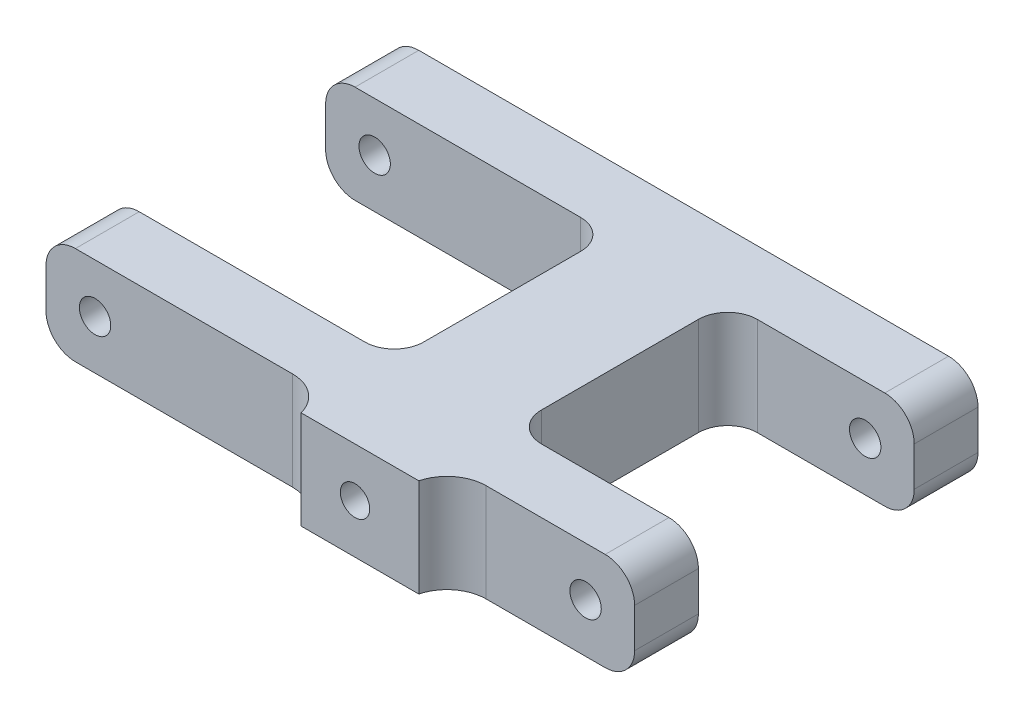
ISO-10303-21;
HEADER;
FILE_DESCRIPTION(('STEP AP214'),'2;1');
FILE_NAME('part.step','',(''),(''),'','','');
FILE_SCHEMA(('AUTOMOTIVE_DESIGN { 1 0 10303 214 1 1 1 1 }'));
ENDSEC;
DATA;
#1=APPLICATION_CONTEXT('core data for automotive mechanical design processes');
#2=APPLICATION_PROTOCOL_DEFINITION('international standard','automotive_design',2000,#1);
#3=PRODUCT_CONTEXT('',#1,'mechanical');
#4=PRODUCT('Part','Part','',(#3));
#5=PRODUCT_RELATED_PRODUCT_CATEGORY('part','',(#4));
#6=PRODUCT_DEFINITION_FORMATION('','',#4);
#7=PRODUCT_DEFINITION_CONTEXT('part definition',#1,'design');
#8=PRODUCT_DEFINITION('design','',#6,#7);
#9=PRODUCT_DEFINITION_SHAPE('','',#8);
#10=(LENGTH_UNIT() NAMED_UNIT(*) SI_UNIT(.MILLI.,.METRE.));
#11=(NAMED_UNIT(*) PLANE_ANGLE_UNIT() SI_UNIT($,.RADIAN.));
#12=(NAMED_UNIT(*) SI_UNIT($,.STERADIAN.) SOLID_ANGLE_UNIT());
#13=UNCERTAINTY_MEASURE_WITH_UNIT(LENGTH_MEASURE(1.E-05),#10,'distance_accuracy_value','');
#14=(GEOMETRIC_REPRESENTATION_CONTEXT(3) GLOBAL_UNCERTAINTY_ASSIGNED_CONTEXT((#13)) GLOBAL_UNIT_ASSIGNED_CONTEXT((#10,
#11,#12)) REPRESENTATION_CONTEXT('',''));
#15=CARTESIAN_POINT('',(0.,0.,0.));
#16=DIRECTION('',(0.,0.,1.));
#17=DIRECTION('',(1.,0.,0.));
#18=AXIS2_PLACEMENT_3D('',#15,#16,#17);
#19=CARTESIAN_POINT('',(0.,10.,35.));
#20=DIRECTION('',(0.,0.,-1.));
#21=DIRECTION('',(-1.,0.,0.));
#22=AXIS2_PLACEMENT_3D('',#19,#20,#21);
#23=PLANE('',#22);
#24=CARTESIAN_POINT('',(5.,5.,35.));
#25=DIRECTION('',(0.,0.,1.));
#26=DIRECTION('',(1.,0.,0.));
#27=AXIS2_PLACEMENT_3D('',#24,#25,#26);
#28=CIRCLE('',#27,1.6);
#29=CARTESIAN_POINT('',(6.6,5.,35.));
#30=VERTEX_POINT('',#29);
#31=EDGE_CURVE('E254',#30,#30,#28,.T.);
#32=ORIENTED_EDGE('',*,*,#31,.F.);
#33=EDGE_LOOP('',(#32));
#34=FACE_BOUND('',#33,.T.);
#35=DIRECTION('',(1.,0.,0.));
#36=VECTOR('',#35,1.);
#37=CARTESIAN_POINT('',(0.,0.,35.));
#38=LINE('',#37,#36);
#39=CARTESIAN_POINT('',(3.,0.,35.));
#40=VERTEX_POINT('',#39);
#41=CARTESIAN_POINT('',(25.1270166537926,0.,35.));
#42=VERTEX_POINT('',#41);
#43=EDGE_CURVE('E312',#40,#42,#38,.T.);
#44=ORIENTED_EDGE('',*,*,#43,.T.);
#45=DIRECTION('',(0.,-1.,0.));
#46=VECTOR('',#45,1.);
#47=CARTESIAN_POINT('',(25.1270166537926,10.,35.));
#48=LINE('',#47,#46);
#49=CARTESIAN_POINT('',(25.1270166537926,10.,35.));
#50=VERTEX_POINT('',#49);
#51=EDGE_CURVE('E54',#42,#50,#48,.F.);
#52=ORIENTED_EDGE('',*,*,#51,.T.);
#53=DIRECTION('',(1.,0.,0.));
#54=VECTOR('',#53,1.);
#55=CARTESIAN_POINT('',(0.,10.,35.));
#56=LINE('',#55,#54);
#57=CARTESIAN_POINT('',(3.,10.,35.));
#58=VERTEX_POINT('',#57);
#59=EDGE_CURVE('E305',#58,#50,#56,.T.);
#60=ORIENTED_EDGE('',*,*,#59,.F.);
#61=CARTESIAN_POINT('',(3.,7.,35.));
#62=DIRECTION('',(0.,0.,-1.));
#63=DIRECTION('',(-1.,0.,0.));
#64=AXIS2_PLACEMENT_3D('',#61,#62,#63);
#65=CIRCLE('',#64,3.);
#66=CARTESIAN_POINT('',(0.,7.,35.));
#67=VERTEX_POINT('',#66);
#68=EDGE_CURVE('E342',#58,#67,#65,.F.);
#69=ORIENTED_EDGE('',*,*,#68,.T.);
#70=DIRECTION('',(0.,-1.,0.));
#71=VECTOR('',#70,1.);
#72=CARTESIAN_POINT('',(0.,10.,35.));
#73=LINE('',#72,#71);
#74=CARTESIAN_POINT('',(0.,3.,35.));
#75=VERTEX_POINT('',#74);
#76=EDGE_CURVE('E325',#67,#75,#73,.T.);
#77=ORIENTED_EDGE('',*,*,#76,.T.);
#78=CARTESIAN_POINT('',(3.,3.,35.));
#79=DIRECTION('',(0.,0.,-1.));
#80=DIRECTION('',(-1.,0.,0.));
#81=AXIS2_PLACEMENT_3D('',#78,#79,#80);
#82=CIRCLE('',#81,3.);
#83=EDGE_CURVE('E344',#75,#40,#82,.F.);
#84=ORIENTED_EDGE('',*,*,#83,.T.);
#85=EDGE_LOOP('',(#44,#52,#60,#69,#77,#84));
#86=FACE_BOUND('',#85,.T.);
#87=ADVANCED_FACE('F33',(#34,#86),#23,.F.);
#88=CARTESIAN_POINT('',(55.,5.,35.));
#89=DIRECTION('',(0.,0.,1.));
#90=DIRECTION('',(1.,0.,0.));
#91=AXIS2_PLACEMENT_3D('',#88,#89,#90);
#92=CIRCLE('',#91,1.59999999999999);
#93=CARTESIAN_POINT('',(56.6,5.,35.));
#94=VERTEX_POINT('',#93);
#95=EDGE_CURVE('E244',#94,#94,#92,.T.);
#96=ORIENTED_EDGE('',*,*,#95,.F.);
#97=EDGE_LOOP('',(#96));
#98=FACE_BOUND('',#97,.T.);
#99=CARTESIAN_POINT('',(44.8729833462074,10.,35.));
#100=VERTEX_POINT('',#99);
#101=CARTESIAN_POINT('',(57.,10.,35.));
#102=VERTEX_POINT('',#101);
#103=EDGE_CURVE('E308',#100,#102,#56,.T.);
#104=ORIENTED_EDGE('',*,*,#103,.F.);
#105=DIRECTION('',(0.,1.,0.));
#106=VECTOR('',#105,1.);
#107=CARTESIAN_POINT('',(44.8729833462074,10.,35.));
#108=LINE('',#107,#106);
#109=CARTESIAN_POINT('',(44.8729833462074,0.,35.));
#110=VERTEX_POINT('',#109);
#111=EDGE_CURVE('E448',#100,#110,#108,.F.);
#112=ORIENTED_EDGE('',*,*,#111,.T.);
#113=CARTESIAN_POINT('',(57.,0.,35.));
#114=VERTEX_POINT('',#113);
#115=EDGE_CURVE('E299',#110,#114,#38,.T.);
#116=ORIENTED_EDGE('',*,*,#115,.T.);
#117=CARTESIAN_POINT('',(57.,3.,35.));
#118=DIRECTION('',(0.,0.,-1.));
#119=DIRECTION('',(-1.,0.,0.));
#120=AXIS2_PLACEMENT_3D('',#117,#118,#119);
#121=CIRCLE('',#120,3.);
#122=CARTESIAN_POINT('',(60.,3.,35.));
#123=VERTEX_POINT('',#122);
#124=EDGE_CURVE('E340',#114,#123,#121,.F.);
#125=ORIENTED_EDGE('',*,*,#124,.T.);
#126=DIRECTION('',(0.,-1.,0.));
#127=VECTOR('',#126,1.);
#128=CARTESIAN_POINT('',(60.,10.,35.));
#129=LINE('',#128,#127);
#130=CARTESIAN_POINT('',(60.,7.,35.));
#131=VERTEX_POINT('',#130);
#132=EDGE_CURVE('E322',#131,#123,#129,.T.);
#133=ORIENTED_EDGE('',*,*,#132,.F.);
#134=CARTESIAN_POINT('',(57.,7.,35.));
#135=DIRECTION('',(0.,0.,-1.));
#136=DIRECTION('',(-1.,0.,0.));
#137=AXIS2_PLACEMENT_3D('',#134,#135,#136);
#138=CIRCLE('',#137,3.);
#139=EDGE_CURVE('E337',#131,#102,#138,.F.);
#140=ORIENTED_EDGE('',*,*,#139,.T.);
#141=EDGE_LOOP('',(#104,#112,#116,#125,#133,#140));
#142=FACE_BOUND('',#141,.T.);
#143=ADVANCED_FACE('F460',(#98,#142),#23,.F.);
#144=CARTESIAN_POINT('',(0.,10.,0.));
#145=DIRECTION('',(1.,0.,0.));
#146=DIRECTION('',(0.,0.,-1.));
#147=AXIS2_PLACEMENT_3D('',#144,#145,#146);
#148=PLANE('',#147);
#149=DIRECTION('',(0.,-1.,0.));
#150=VECTOR('',#149,1.);
#151=CARTESIAN_POINT('',(0.,10.,0.));
#152=LINE('',#151,#150);
#153=CARTESIAN_POINT('',(0.,7.,0.));
#154=VERTEX_POINT('',#153);
#155=CARTESIAN_POINT('',(0.,3.,0.));
#156=VERTEX_POINT('',#155);
#157=EDGE_CURVE('E311',#154,#156,#152,.T.);
#158=ORIENTED_EDGE('',*,*,#157,.T.);
#159=DIRECTION('',(0.,0.,1.));
#160=VECTOR('',#159,1.);
#161=CARTESIAN_POINT('',(0.,3.,0.));
#162=LINE('',#161,#160);
#163=CARTESIAN_POINT('',(0.,3.,6.5));
#164=VERTEX_POINT('',#163);
#165=EDGE_CURVE('E376',#156,#164,#162,.T.);
#166=ORIENTED_EDGE('',*,*,#165,.T.);
#167=DIRECTION('',(0.,-1.,0.));
#168=VECTOR('',#167,1.);
#169=CARTESIAN_POINT('',(0.,10.,6.5));
#170=LINE('',#169,#168);
#171=CARTESIAN_POINT('',(0.,7.,6.5));
#172=VERTEX_POINT('',#171);
#173=EDGE_CURVE('E264',#172,#164,#170,.T.);
#174=ORIENTED_EDGE('',*,*,#173,.F.);
#175=DIRECTION('',(0.,0.,1.));
#176=VECTOR('',#175,1.);
#177=CARTESIAN_POINT('',(0.,7.,0.));
#178=LINE('',#177,#176);
#179=EDGE_CURVE('E374',#172,#154,#178,.F.);
#180=ORIENTED_EDGE('',*,*,#179,.T.);
#181=EDGE_LOOP('',(#158,#166,#174,#180));
#182=FACE_BOUND('',#181,.T.);
#183=ADVANCED_FACE('F481',(#182),#148,.F.);
#184=CARTESIAN_POINT('',(60.,10.,0.));
#185=DIRECTION('',(-1.,0.,0.));
#186=DIRECTION('',(0.,0.,1.));
#187=AXIS2_PLACEMENT_3D('',#184,#185,#186);
#188=PLANE('',#187);
#189=ORIENTED_EDGE('',*,*,#132,.T.);
#190=DIRECTION('',(0.,0.,-1.));
#191=VECTOR('',#190,1.);
#192=CARTESIAN_POINT('',(60.,3.,0.));
#193=LINE('',#192,#191);
#194=CARTESIAN_POINT('',(60.,3.,28.5));
#195=VERTEX_POINT('',#194);
#196=EDGE_CURVE('E404',#123,#195,#193,.T.);
#197=ORIENTED_EDGE('',*,*,#196,.T.);
#198=DIRECTION('',(0.,-1.,0.));
#199=VECTOR('',#198,1.);
#200=CARTESIAN_POINT('',(60.,10.,28.5));
#201=LINE('',#200,#199);
#202=CARTESIAN_POINT('',(60.,7.,28.5));
#203=VERTEX_POINT('',#202);
#204=EDGE_CURVE('E279',#203,#195,#201,.T.);
#205=ORIENTED_EDGE('',*,*,#204,.F.);
#206=DIRECTION('',(0.,0.,-1.));
#207=VECTOR('',#206,1.);
#208=CARTESIAN_POINT('',(60.,7.,35.));
#209=LINE('',#208,#207);
#210=EDGE_CURVE('E402',#203,#131,#209,.F.);
#211=ORIENTED_EDGE('',*,*,#210,.T.);
#212=EDGE_LOOP('',(#189,#197,#205,#211));
#213=FACE_BOUND('',#212,.T.);
#214=ADVANCED_FACE('F491',(#213),#188,.F.);
#215=DIRECTION('',(0.,1.,0.));
#216=VECTOR('',#215,1.);
#217=CARTESIAN_POINT('',(0.,10.,28.5));
#218=LINE('',#217,#216);
#219=CARTESIAN_POINT('',(0.,3.,28.5));
#220=VERTEX_POINT('',#219);
#221=CARTESIAN_POINT('',(0.,7.,28.5));
#222=VERTEX_POINT('',#221);
#223=EDGE_CURVE('E269',#220,#222,#218,.T.);
#224=ORIENTED_EDGE('',*,*,#223,.F.);
#225=DIRECTION('',(0.,0.,1.));
#226=VECTOR('',#225,1.);
#227=CARTESIAN_POINT('',(0.,3.,0.));
#228=LINE('',#227,#226);
#229=EDGE_CURVE('E334',#220,#75,#228,.T.);
#230=ORIENTED_EDGE('',*,*,#229,.T.);
#231=ORIENTED_EDGE('',*,*,#76,.F.);
#232=DIRECTION('',(0.,0.,1.));
#233=VECTOR('',#232,1.);
#234=CARTESIAN_POINT('',(0.,7.,28.5));
#235=LINE('',#234,#233);
#236=EDGE_CURVE('E328',#67,#222,#235,.F.);
#237=ORIENTED_EDGE('',*,*,#236,.T.);
#238=EDGE_LOOP('',(#224,#230,#231,#237));
#239=FACE_BOUND('',#238,.T.);
#240=ADVANCED_FACE('F488',(#239),#148,.F.);
#241=DIRECTION('',(0.,-1.,0.));
#242=VECTOR('',#241,1.);
#243=CARTESIAN_POINT('',(60.,10.,0.));
#244=LINE('',#243,#242);
#245=CARTESIAN_POINT('',(60.,7.,0.));
#246=VERTEX_POINT('',#245);
#247=CARTESIAN_POINT('',(60.,3.,0.));
#248=VERTEX_POINT('',#247);
#249=EDGE_CURVE('E319',#246,#248,#244,.T.);
#250=ORIENTED_EDGE('',*,*,#249,.F.);
#251=DIRECTION('',(0.,0.,-1.));
#252=VECTOR('',#251,1.);
#253=CARTESIAN_POINT('',(60.,7.,6.5));
#254=LINE('',#253,#252);
#255=CARTESIAN_POINT('',(60.,7.,6.5));
#256=VERTEX_POINT('',#255);
#257=EDGE_CURVE('E395',#246,#256,#254,.F.);
#258=ORIENTED_EDGE('',*,*,#257,.T.);
#259=DIRECTION('',(0.,1.,0.));
#260=VECTOR('',#259,1.);
#261=CARTESIAN_POINT('',(60.,10.,6.5));
#262=LINE('',#261,#260);
#263=CARTESIAN_POINT('',(60.,3.,6.5));
#264=VERTEX_POINT('',#263);
#265=EDGE_CURVE('E289',#264,#256,#262,.T.);
#266=ORIENTED_EDGE('',*,*,#265,.F.);
#267=DIRECTION('',(0.,0.,-1.));
#268=VECTOR('',#267,1.);
#269=CARTESIAN_POINT('',(60.,3.,0.));
#270=LINE('',#269,#268);
#271=EDGE_CURVE('E392',#264,#248,#270,.T.);
#272=ORIENTED_EDGE('',*,*,#271,.T.);
#273=EDGE_LOOP('',(#250,#258,#266,#272));
#274=FACE_BOUND('',#273,.T.);
#275=ADVANCED_FACE('F486',(#274),#188,.F.);
#276=CARTESIAN_POINT('',(0.,10.,0.));
#277=DIRECTION('',(0.,0.,1.));
#278=DIRECTION('',(1.,0.,0.));
#279=AXIS2_PLACEMENT_3D('',#276,#277,#278);
#280=PLANE('',#279);
#281=CARTESIAN_POINT('',(55.,5.,0.));
#282=DIRECTION('',(0.,0.,1.));
#283=DIRECTION('',(1.,0.,0.));
#284=AXIS2_PLACEMENT_3D('',#281,#282,#283);
#285=CIRCLE('',#284,1.59999999999999);
#286=CARTESIAN_POINT('',(56.6,5.,0.));
#287=VERTEX_POINT('',#286);
#288=EDGE_CURVE('E245',#287,#287,#285,.T.);
#289=ORIENTED_EDGE('',*,*,#288,.T.);
#290=EDGE_LOOP('',(#289));
#291=FACE_BOUND('',#290,.T.);
#292=CARTESIAN_POINT('',(5.,5.,0.));
#293=DIRECTION('',(0.,0.,1.));
#294=DIRECTION('',(1.,0.,0.));
#295=AXIS2_PLACEMENT_3D('',#292,#293,#294);
#296=CIRCLE('',#295,1.6);
#297=CARTESIAN_POINT('',(6.6,5.,0.));
#298=VERTEX_POINT('',#297);
#299=EDGE_CURVE('E255',#298,#298,#296,.T.);
#300=ORIENTED_EDGE('',*,*,#299,.T.);
#301=EDGE_LOOP('',(#300));
#302=FACE_BOUND('',#301,.T.);
#303=DIRECTION('',(-1.,0.,0.));
#304=VECTOR('',#303,1.);
#305=CARTESIAN_POINT('',(0.,0.,0.));
#306=LINE('',#305,#304);
#307=CARTESIAN_POINT('',(57.,0.,0.));
#308=VERTEX_POINT('',#307);
#309=CARTESIAN_POINT('',(3.,0.,0.));
#310=VERTEX_POINT('',#309);
#311=EDGE_CURVE('E314',#308,#310,#306,.T.);
#312=ORIENTED_EDGE('',*,*,#311,.T.);
#313=CARTESIAN_POINT('',(3.,3.,0.));
#314=DIRECTION('',(0.,0.,1.));
#315=DIRECTION('',(1.,0.,0.));
#316=AXIS2_PLACEMENT_3D('',#313,#314,#315);
#317=CIRCLE('',#316,3.);
#318=EDGE_CURVE('E390',#310,#156,#317,.F.);
#319=ORIENTED_EDGE('',*,*,#318,.T.);
#320=ORIENTED_EDGE('',*,*,#157,.F.);
#321=CARTESIAN_POINT('',(3.,7.,0.));
#322=DIRECTION('',(0.,0.,1.));
#323=DIRECTION('',(1.,0.,0.));
#324=AXIS2_PLACEMENT_3D('',#321,#322,#323);
#325=CIRCLE('',#324,3.);
#326=CARTESIAN_POINT('',(3.,10.,0.));
#327=VERTEX_POINT('',#326);
#328=EDGE_CURVE('E388',#154,#327,#325,.F.);
#329=ORIENTED_EDGE('',*,*,#328,.T.);
#330=DIRECTION('',(-1.,0.,0.));
#331=VECTOR('',#330,1.);
#332=CARTESIAN_POINT('',(0.,10.,0.));
#333=LINE('',#332,#331);
#334=CARTESIAN_POINT('',(57.,10.,0.));
#335=VERTEX_POINT('',#334);
#336=EDGE_CURVE('E307',#335,#327,#333,.T.);
#337=ORIENTED_EDGE('',*,*,#336,.F.);
#338=CARTESIAN_POINT('',(57.,7.,0.));
#339=DIRECTION('',(0.,0.,1.));
#340=DIRECTION('',(1.,0.,0.));
#341=AXIS2_PLACEMENT_3D('',#338,#339,#340);
#342=CIRCLE('',#341,3.);
#343=EDGE_CURVE('E386',#335,#246,#342,.F.);
#344=ORIENTED_EDGE('',*,*,#343,.T.);
#345=ORIENTED_EDGE('',*,*,#249,.T.);
#346=CARTESIAN_POINT('',(57.,3.,0.));
#347=DIRECTION('',(0.,0.,1.));
#348=DIRECTION('',(1.,0.,0.));
#349=AXIS2_PLACEMENT_3D('',#346,#347,#348);
#350=CIRCLE('',#349,3.);
#351=EDGE_CURVE('E384',#248,#308,#350,.F.);
#352=ORIENTED_EDGE('',*,*,#351,.T.);
#353=EDGE_LOOP('',(#312,#319,#320,#329,#337,#344,#345,#352));
#354=FACE_BOUND('',#353,.T.);
#355=ADVANCED_FACE('F577',(#291,#302,#354),#280,.F.);
#356=CARTESIAN_POINT('',(0.,10.,0.));
#357=DIRECTION('',(0.,1.,0.));
#358=DIRECTION('',(0.,0.,1.));
#359=AXIS2_PLACEMENT_3D('',#356,#357,#358);
#360=PLANE('',#359);
#361=DIRECTION('',(0.,0.,-1.));
#362=VECTOR('',#361,1.);
#363=CARTESIAN_POINT('',(29.,10.,6.5));
#364=LINE('',#363,#362);
#365=CARTESIAN_POINT('',(29.,10.,25.5));
#366=VERTEX_POINT('',#365);
#367=CARTESIAN_POINT('',(29.,10.,9.5));
#368=VERTEX_POINT('',#367);
#369=EDGE_CURVE('E268',#366,#368,#364,.T.);
#370=ORIENTED_EDGE('',*,*,#369,.F.);
#371=CARTESIAN_POINT('',(26.,10.,25.5));
#372=DIRECTION('',(0.,1.,0.));
#373=DIRECTION('',(0.,0.,1.));
#374=AXIS2_PLACEMENT_3D('',#371,#372,#373);
#375=CIRCLE('',#374,3.);
#376=CARTESIAN_POINT('',(26.,10.,28.5));
#377=VERTEX_POINT('',#376);
#378=EDGE_CURVE('E440',#366,#377,#375,.F.);
#379=ORIENTED_EDGE('',*,*,#378,.T.);
#380=DIRECTION('',(-1.,0.,0.));
#381=VECTOR('',#380,1.);
#382=CARTESIAN_POINT('',(29.,10.,28.5));
#383=LINE('',#382,#381);
#384=CARTESIAN_POINT('',(3.00000000000001,10.,28.5));
#385=VERTEX_POINT('',#384);
#386=EDGE_CURVE('E280',#377,#385,#383,.T.);
#387=ORIENTED_EDGE('',*,*,#386,.T.);
#388=DIRECTION('',(0.,0.,1.));
#389=VECTOR('',#388,1.);
#390=CARTESIAN_POINT('',(3.,10.,35.));
#391=LINE('',#390,#389);
#392=EDGE_CURVE('E371',#385,#58,#391,.T.);
#393=ORIENTED_EDGE('',*,*,#392,.T.);
#394=ORIENTED_EDGE('',*,*,#59,.T.);
#395=CARTESIAN_POINT('',(25.1270166537926,10.,39.));
#396=DIRECTION('',(0.,1.,0.));
#397=DIRECTION('',(0.,0.,1.));
#398=AXIS2_PLACEMENT_3D('',#395,#396,#397);
#399=CIRCLE('',#398,4.);
#400=CARTESIAN_POINT('',(29.,10.,38.));
#401=VERTEX_POINT('',#400);
#402=EDGE_CURVE('E11',#50,#401,#399,.F.);
#403=ORIENTED_EDGE('',*,*,#402,.T.);
#404=DIRECTION('',(-1.,0.,0.));
#405=VECTOR('',#404,1.);
#406=CARTESIAN_POINT('',(29.,10.,38.));
#407=LINE('',#406,#405);
#408=CARTESIAN_POINT('',(41.,10.,38.));
#409=VERTEX_POINT('',#408);
#410=EDGE_CURVE('E234',#409,#401,#407,.T.);
#411=ORIENTED_EDGE('',*,*,#410,.F.);
#412=CARTESIAN_POINT('',(44.8729833462074,10.,39.));
#413=DIRECTION('',(0.,1.,0.));
#414=DIRECTION('',(0.,0.,1.));
#415=AXIS2_PLACEMENT_3D('',#412,#413,#414);
#416=CIRCLE('',#415,4.);
#417=EDGE_CURVE('E451',#409,#100,#416,.F.);
#418=ORIENTED_EDGE('',*,*,#417,.T.);
#419=ORIENTED_EDGE('',*,*,#103,.T.);
#420=DIRECTION('',(0.,0.,-1.));
#421=VECTOR('',#420,1.);
#422=CARTESIAN_POINT('',(57.,10.,28.5));
#423=LINE('',#422,#421);
#424=CARTESIAN_POINT('',(57.,10.,28.5));
#425=VERTEX_POINT('',#424);
#426=EDGE_CURVE('E362',#102,#425,#423,.T.);
#427=ORIENTED_EDGE('',*,*,#426,.T.);
#428=DIRECTION('',(1.,0.,0.));
#429=VECTOR('',#428,1.);
#430=CARTESIAN_POINT('',(41.,10.,28.5));
#431=LINE('',#430,#429);
#432=CARTESIAN_POINT('',(44.,10.,28.5));
#433=VERTEX_POINT('',#432);
#434=EDGE_CURVE('E297',#433,#425,#431,.T.);
#435=ORIENTED_EDGE('',*,*,#434,.F.);
#436=CARTESIAN_POINT('',(44.,10.,25.5));
#437=DIRECTION('',(0.,1.,0.));
#438=DIRECTION('',(0.,0.,1.));
#439=AXIS2_PLACEMENT_3D('',#436,#437,#438);
#440=CIRCLE('',#439,3.);
#441=CARTESIAN_POINT('',(41.,10.,25.5));
#442=VERTEX_POINT('',#441);
#443=EDGE_CURVE('E434',#433,#442,#440,.F.);
#444=ORIENTED_EDGE('',*,*,#443,.T.);
#445=DIRECTION('',(0.,0.,1.));
#446=VECTOR('',#445,1.);
#447=CARTESIAN_POINT('',(41.,10.,28.5));
#448=LINE('',#447,#446);
#449=CARTESIAN_POINT('',(41.,10.,9.5));
#450=VERTEX_POINT('',#449);
#451=EDGE_CURVE('E288',#450,#442,#448,.T.);
#452=ORIENTED_EDGE('',*,*,#451,.F.);
#453=CARTESIAN_POINT('',(44.,10.,9.5));
#454=DIRECTION('',(0.,1.,0.));
#455=DIRECTION('',(0.,0.,1.));
#456=AXIS2_PLACEMENT_3D('',#453,#454,#455);
#457=CIRCLE('',#456,3.);
#458=CARTESIAN_POINT('',(44.,10.,6.5));
#459=VERTEX_POINT('',#458);
#460=EDGE_CURVE('E436',#450,#459,#457,.F.);
#461=ORIENTED_EDGE('',*,*,#460,.T.);
#462=DIRECTION('',(1.,0.,0.));
#463=VECTOR('',#462,1.);
#464=CARTESIAN_POINT('',(41.,10.,6.5));
#465=LINE('',#464,#463);
#466=CARTESIAN_POINT('',(57.,10.,6.5));
#467=VERTEX_POINT('',#466);
#468=EDGE_CURVE('E300',#459,#467,#465,.T.);
#469=ORIENTED_EDGE('',*,*,#468,.T.);
#470=DIRECTION('',(0.,0.,-1.));
#471=VECTOR('',#470,1.);
#472=CARTESIAN_POINT('',(57.,10.,0.));
#473=LINE('',#472,#471);
#474=EDGE_CURVE('E365',#467,#335,#473,.T.);
#475=ORIENTED_EDGE('',*,*,#474,.T.);
#476=ORIENTED_EDGE('',*,*,#336,.T.);
#477=DIRECTION('',(0.,0.,1.));
#478=VECTOR('',#477,1.);
#479=CARTESIAN_POINT('',(3.,10.,6.5));
#480=LINE('',#479,#478);
#481=CARTESIAN_POINT('',(3.00000000000001,10.,6.5));
#482=VERTEX_POINT('',#481);
#483=EDGE_CURVE('E368',#327,#482,#480,.T.);
#484=ORIENTED_EDGE('',*,*,#483,.T.);
#485=DIRECTION('',(-1.,0.,0.));
#486=VECTOR('',#485,1.);
#487=CARTESIAN_POINT('',(29.,10.,6.5));
#488=LINE('',#487,#486);
#489=CARTESIAN_POINT('',(26.,10.,6.5));
#490=VERTEX_POINT('',#489);
#491=EDGE_CURVE('E277',#490,#482,#488,.T.);
#492=ORIENTED_EDGE('',*,*,#491,.F.);
#493=CARTESIAN_POINT('',(26.,10.,9.5));
#494=DIRECTION('',(0.,1.,0.));
#495=DIRECTION('',(0.,0.,1.));
#496=AXIS2_PLACEMENT_3D('',#493,#494,#495);
#497=CIRCLE('',#496,3.);
#498=EDGE_CURVE('E446',#490,#368,#497,.F.);
#499=ORIENTED_EDGE('',*,*,#498,.T.);
#500=EDGE_LOOP('',(#370,#379,#387,#393,#394,#403,#411,#418,#419,#427,#435,#444,#452,#461,#469,
#475,#476,#484,#492,#499));
#501=FACE_BOUND('',#500,.T.);
#502=ADVANCED_FACE('F456',(#501),#360,.T.);
#503=CARTESIAN_POINT('',(0.,0.,0.));
#504=DIRECTION('',(0.,1.,0.));
#505=DIRECTION('',(0.,0.,1.));
#506=AXIS2_PLACEMENT_3D('',#503,#504,#505);
#507=PLANE('',#506);
#508=ORIENTED_EDGE('',*,*,#43,.F.);
#509=DIRECTION('',(0.,0.,1.));
#510=VECTOR('',#509,1.);
#511=CARTESIAN_POINT('',(3.,0.,0.));
#512=LINE('',#511,#510);
#513=CARTESIAN_POINT('',(3.00000000000001,0.,28.5));
#514=VERTEX_POINT('',#513);
#515=EDGE_CURVE('E354',#40,#514,#512,.F.);
#516=ORIENTED_EDGE('',*,*,#515,.T.);
#517=DIRECTION('',(-1.,0.,0.));
#518=VECTOR('',#517,1.);
#519=CARTESIAN_POINT('',(29.,0.,28.5));
#520=LINE('',#519,#518);
#521=CARTESIAN_POINT('',(26.,0.,28.5));
#522=VERTEX_POINT('',#521);
#523=EDGE_CURVE('E282',#522,#514,#520,.T.);
#524=ORIENTED_EDGE('',*,*,#523,.F.);
#525=CARTESIAN_POINT('',(26.,0.,25.5));
#526=DIRECTION('',(0.,1.,0.));
#527=DIRECTION('',(0.,0.,1.));
#528=AXIS2_PLACEMENT_3D('',#525,#526,#527);
#529=CIRCLE('',#528,3.);
#530=CARTESIAN_POINT('',(29.,0.,25.5));
#531=VERTEX_POINT('',#530);
#532=EDGE_CURVE('E442',#522,#531,#529,.T.);
#533=ORIENTED_EDGE('',*,*,#532,.T.);
#534=DIRECTION('',(0.,0.,1.));
#535=VECTOR('',#534,1.);
#536=CARTESIAN_POINT('',(29.,0.,6.5));
#537=LINE('',#536,#535);
#538=CARTESIAN_POINT('',(29.,0.,9.5));
#539=VERTEX_POINT('',#538);
#540=EDGE_CURVE('E265',#539,#531,#537,.T.);
#541=ORIENTED_EDGE('',*,*,#540,.F.);
#542=CARTESIAN_POINT('',(26.,0.,9.5));
#543=DIRECTION('',(0.,1.,0.));
#544=DIRECTION('',(0.,0.,1.));
#545=AXIS2_PLACEMENT_3D('',#542,#543,#544);
#546=CIRCLE('',#545,3.);
#547=CARTESIAN_POINT('',(26.,0.,6.5));
#548=VERTEX_POINT('',#547);
#549=EDGE_CURVE('E444',#539,#548,#546,.T.);
#550=ORIENTED_EDGE('',*,*,#549,.T.);
#551=DIRECTION('',(-1.,0.,0.));
#552=VECTOR('',#551,1.);
#553=CARTESIAN_POINT('',(29.,0.,6.5));
#554=LINE('',#553,#552);
#555=CARTESIAN_POINT('',(3.00000000000001,0.,6.5));
#556=VERTEX_POINT('',#555);
#557=EDGE_CURVE('E272',#548,#556,#554,.T.);
#558=ORIENTED_EDGE('',*,*,#557,.T.);
#559=DIRECTION('',(0.,0.,1.));
#560=VECTOR('',#559,1.);
#561=CARTESIAN_POINT('',(3.,0.,0.));
#562=LINE('',#561,#560);
#563=EDGE_CURVE('E352',#556,#310,#562,.F.);
#564=ORIENTED_EDGE('',*,*,#563,.T.);
#565=ORIENTED_EDGE('',*,*,#311,.F.);
#566=DIRECTION('',(0.,0.,-1.));
#567=VECTOR('',#566,1.);
#568=CARTESIAN_POINT('',(57.,0.,0.));
#569=LINE('',#568,#567);
#570=CARTESIAN_POINT('',(57.,0.,6.5));
#571=VERTEX_POINT('',#570);
#572=EDGE_CURVE('E349',#308,#571,#569,.F.);
#573=ORIENTED_EDGE('',*,*,#572,.T.);
#574=DIRECTION('',(1.,0.,0.));
#575=VECTOR('',#574,1.);
#576=CARTESIAN_POINT('',(41.,0.,6.5));
#577=LINE('',#576,#575);
#578=CARTESIAN_POINT('',(44.,0.,6.5));
#579=VERTEX_POINT('',#578);
#580=EDGE_CURVE('E302',#579,#571,#577,.T.);
#581=ORIENTED_EDGE('',*,*,#580,.F.);
#582=CARTESIAN_POINT('',(44.,0.,9.5));
#583=DIRECTION('',(0.,1.,0.));
#584=DIRECTION('',(0.,0.,1.));
#585=AXIS2_PLACEMENT_3D('',#582,#583,#584);
#586=CIRCLE('',#585,3.);
#587=CARTESIAN_POINT('',(41.,0.,9.5));
#588=VERTEX_POINT('',#587);
#589=EDGE_CURVE('E438',#579,#588,#586,.T.);
#590=ORIENTED_EDGE('',*,*,#589,.T.);
#591=DIRECTION('',(0.,0.,-1.));
#592=VECTOR('',#591,1.);
#593=CARTESIAN_POINT('',(41.,0.,28.5));
#594=LINE('',#593,#592);
#595=CARTESIAN_POINT('',(41.,0.,25.5));
#596=VERTEX_POINT('',#595);
#597=EDGE_CURVE('E285',#596,#588,#594,.T.);
#598=ORIENTED_EDGE('',*,*,#597,.F.);
#599=CARTESIAN_POINT('',(44.,0.,25.5));
#600=DIRECTION('',(0.,1.,0.));
#601=DIRECTION('',(0.,0.,1.));
#602=AXIS2_PLACEMENT_3D('',#599,#600,#601);
#603=CIRCLE('',#602,3.);
#604=CARTESIAN_POINT('',(44.,0.,28.5));
#605=VERTEX_POINT('',#604);
#606=EDGE_CURVE('E432',#596,#605,#603,.T.);
#607=ORIENTED_EDGE('',*,*,#606,.T.);
#608=DIRECTION('',(1.,0.,0.));
#609=VECTOR('',#608,1.);
#610=CARTESIAN_POINT('',(41.,0.,28.5));
#611=LINE('',#610,#609);
#612=CARTESIAN_POINT('',(57.,0.,28.5));
#613=VERTEX_POINT('',#612);
#614=EDGE_CURVE('E292',#605,#613,#611,.T.);
#615=ORIENTED_EDGE('',*,*,#614,.T.);
#616=DIRECTION('',(0.,0.,-1.));
#617=VECTOR('',#616,1.);
#618=CARTESIAN_POINT('',(57.,0.,0.));
#619=LINE('',#618,#617);
#620=EDGE_CURVE('E346',#613,#114,#619,.F.);
#621=ORIENTED_EDGE('',*,*,#620,.T.);
#622=ORIENTED_EDGE('',*,*,#115,.F.);
#623=CARTESIAN_POINT('',(44.8729833462074,0.,39.));
#624=DIRECTION('',(0.,1.,0.));
#625=DIRECTION('',(0.,0.,1.));
#626=AXIS2_PLACEMENT_3D('',#623,#624,#625);
#627=CIRCLE('',#626,4.);
#628=CARTESIAN_POINT('',(41.,0.,38.));
#629=VERTEX_POINT('',#628);
#630=EDGE_CURVE('E220',#110,#629,#627,.T.);
#631=ORIENTED_EDGE('',*,*,#630,.T.);
#632=DIRECTION('',(1.,0.,0.));
#633=VECTOR('',#632,1.);
#634=CARTESIAN_POINT('',(29.,0.,38.));
#635=LINE('',#634,#633);
#636=CARTESIAN_POINT('',(29.,0.,38.));
#637=VERTEX_POINT('',#636);
#638=EDGE_CURVE('E222',#637,#629,#635,.T.);
#639=ORIENTED_EDGE('',*,*,#638,.F.);
#640=CARTESIAN_POINT('',(25.1270166537926,0.,39.));
#641=DIRECTION('',(0.,1.,0.));
#642=DIRECTION('',(0.,0.,1.));
#643=AXIS2_PLACEMENT_3D('',#640,#641,#642);
#644=CIRCLE('',#643,4.);
#645=EDGE_CURVE('E41',#637,#42,#644,.T.);
#646=ORIENTED_EDGE('',*,*,#645,.T.);
#647=EDGE_LOOP('',(#508,#516,#524,#533,#541,#550,#558,#564,#565,#573,#581,#590,#598,#607,#615,
#621,#622,#631,#639,#646));
#648=FACE_BOUND('',#647,.T.);
#649=ADVANCED_FACE('F223',(#648),#507,.F.);
#650=CARTESIAN_POINT('',(41.,10.,28.5));
#651=DIRECTION('',(0.,0.,1.));
#652=DIRECTION('',(1.,0.,0.));
#653=AXIS2_PLACEMENT_3D('',#650,#651,#652);
#654=PLANE('',#653);
#655=CARTESIAN_POINT('',(55.,5.,28.5));
#656=DIRECTION('',(0.,0.,1.));
#657=DIRECTION('',(1.,0.,0.));
#658=AXIS2_PLACEMENT_3D('',#655,#656,#657);
#659=CIRCLE('',#658,1.59999999999999);
#660=CARTESIAN_POINT('',(56.6,5.,28.5));
#661=VERTEX_POINT('',#660);
#662=EDGE_CURVE('E251',#661,#661,#659,.T.);
#663=ORIENTED_EDGE('',*,*,#662,.T.);
#664=EDGE_LOOP('',(#663));
#665=FACE_BOUND('',#664,.T.);
#666=ORIENTED_EDGE('',*,*,#614,.F.);
#667=DIRECTION('',(0.,-1.,0.));
#668=VECTOR('',#667,1.);
#669=CARTESIAN_POINT('',(44.,10.,28.5));
#670=LINE('',#669,#668);
#671=EDGE_CURVE('E418',#605,#433,#670,.F.);
#672=ORIENTED_EDGE('',*,*,#671,.T.);
#673=ORIENTED_EDGE('',*,*,#434,.T.);
#674=CARTESIAN_POINT('',(57.,7.,28.5));
#675=DIRECTION('',(0.,0.,1.));
#676=DIRECTION('',(1.,0.,0.));
#677=AXIS2_PLACEMENT_3D('',#674,#675,#676);
#678=CIRCLE('',#677,3.);
#679=EDGE_CURVE('E407',#425,#203,#678,.F.);
#680=ORIENTED_EDGE('',*,*,#679,.T.);
#681=ORIENTED_EDGE('',*,*,#204,.T.);
#682=CARTESIAN_POINT('',(57.,3.,28.5));
#683=DIRECTION('',(0.,0.,1.));
#684=DIRECTION('',(1.,0.,0.));
#685=AXIS2_PLACEMENT_3D('',#682,#683,#684);
#686=CIRCLE('',#685,3.);
#687=EDGE_CURVE('E409',#195,#613,#686,.F.);
#688=ORIENTED_EDGE('',*,*,#687,.T.);
#689=EDGE_LOOP('',(#666,#672,#673,#680,#681,#688));
#690=FACE_BOUND('',#689,.T.);
#691=ADVANCED_FACE('F615',(#665,#690),#654,.F.);
#692=CARTESIAN_POINT('',(41.,10.,6.5));
#693=DIRECTION('',(0.,0.,-1.));
#694=DIRECTION('',(0.,1.,0.));
#695=AXIS2_PLACEMENT_3D('',#692,#693,#694);
#696=PLANE('',#695);
#697=CARTESIAN_POINT('',(55.,5.,6.5));
#698=DIRECTION('',(0.,0.,-1.));
#699=DIRECTION('',(0.,1.,0.));
#700=AXIS2_PLACEMENT_3D('',#697,#698,#699);
#701=CIRCLE('',#700,1.59999999999999);
#702=CARTESIAN_POINT('',(55.,6.59999999999999,6.5));
#703=VERTEX_POINT('',#702);
#704=EDGE_CURVE('E248',#703,#703,#701,.T.);
#705=ORIENTED_EDGE('',*,*,#704,.T.);
#706=EDGE_LOOP('',(#705));
#707=FACE_BOUND('',#706,.T.);
#708=ORIENTED_EDGE('',*,*,#468,.F.);
#709=DIRECTION('',(0.,1.,0.));
#710=VECTOR('',#709,1.);
#711=CARTESIAN_POINT('',(44.,10.,6.5));
#712=LINE('',#711,#710);
#713=EDGE_CURVE('E420',#459,#579,#712,.F.);
#714=ORIENTED_EDGE('',*,*,#713,.T.);
#715=ORIENTED_EDGE('',*,*,#580,.T.);
#716=CARTESIAN_POINT('',(57.,3.,6.5));
#717=DIRECTION('',(0.,0.,-1.));
#718=DIRECTION('',(0.,1.,0.));
#719=AXIS2_PLACEMENT_3D('',#716,#717,#718);
#720=CIRCLE('',#719,3.);
#721=EDGE_CURVE('E397',#571,#264,#720,.F.);
#722=ORIENTED_EDGE('',*,*,#721,.T.);
#723=ORIENTED_EDGE('',*,*,#265,.T.);
#724=CARTESIAN_POINT('',(57.,7.,6.5));
#725=DIRECTION('',(0.,0.,-1.));
#726=DIRECTION('',(0.,1.,0.));
#727=AXIS2_PLACEMENT_3D('',#724,#725,#726);
#728=CIRCLE('',#727,3.);
#729=EDGE_CURVE('E399',#256,#467,#728,.F.);
#730=ORIENTED_EDGE('',*,*,#729,.T.);
#731=EDGE_LOOP('',(#708,#714,#715,#722,#723,#730));
#732=FACE_BOUND('',#731,.T.);
#733=ADVANCED_FACE('F588',(#707,#732),#696,.F.);
#734=CARTESIAN_POINT('',(41.,0.,0.));
#735=DIRECTION('',(1.,0.,0.));
#736=DIRECTION('',(0.,0.,-1.));
#737=AXIS2_PLACEMENT_3D('',#734,#735,#736);
#738=PLANE('',#737);
#739=ORIENTED_EDGE('',*,*,#451,.T.);
#740=DIRECTION('',(0.,-1.,0.));
#741=VECTOR('',#740,1.);
#742=CARTESIAN_POINT('',(41.,0.,25.5));
#743=LINE('',#742,#741);
#744=EDGE_CURVE('E415',#442,#596,#743,.T.);
#745=ORIENTED_EDGE('',*,*,#744,.T.);
#746=ORIENTED_EDGE('',*,*,#597,.T.);
#747=DIRECTION('',(0.,1.,0.));
#748=VECTOR('',#747,1.);
#749=CARTESIAN_POINT('',(41.,0.,9.5));
#750=LINE('',#749,#748);
#751=EDGE_CURVE('E412',#588,#450,#750,.T.);
#752=ORIENTED_EDGE('',*,*,#751,.T.);
#753=EDGE_LOOP('',(#739,#745,#746,#752));
#754=FACE_BOUND('',#753,.T.);
#755=ADVANCED_FACE('F622',(#754),#738,.T.);
#756=CARTESIAN_POINT('',(29.,10.,6.5));
#757=DIRECTION('',(0.,0.,-1.));
#758=DIRECTION('',(0.,1.,0.));
#759=AXIS2_PLACEMENT_3D('',#756,#757,#758);
#760=PLANE('',#759);
#761=CARTESIAN_POINT('',(5.,5.,6.5));
#762=DIRECTION('',(0.,0.,-1.));
#763=DIRECTION('',(0.,1.,0.));
#764=AXIS2_PLACEMENT_3D('',#761,#762,#763);
#765=CIRCLE('',#764,1.6);
#766=CARTESIAN_POINT('',(5.,6.6,6.5));
#767=VERTEX_POINT('',#766);
#768=EDGE_CURVE('E261',#767,#767,#765,.T.);
#769=ORIENTED_EDGE('',*,*,#768,.T.);
#770=EDGE_LOOP('',(#769));
#771=FACE_BOUND('',#770,.T.);
#772=ORIENTED_EDGE('',*,*,#557,.F.);
#773=DIRECTION('',(0.,-1.,0.));
#774=VECTOR('',#773,1.);
#775=CARTESIAN_POINT('',(26.,10.,6.5));
#776=LINE('',#775,#774);
#777=EDGE_CURVE('E430',#548,#490,#776,.F.);
#778=ORIENTED_EDGE('',*,*,#777,.T.);
#779=ORIENTED_EDGE('',*,*,#491,.T.);
#780=CARTESIAN_POINT('',(3.,7.,6.5));
#781=DIRECTION('',(0.,0.,-1.));
#782=DIRECTION('',(0.,1.,0.));
#783=AXIS2_PLACEMENT_3D('',#780,#781,#782);
#784=CIRCLE('',#783,3.);
#785=EDGE_CURVE('E379',#482,#172,#784,.F.);
#786=ORIENTED_EDGE('',*,*,#785,.T.);
#787=ORIENTED_EDGE('',*,*,#173,.T.);
#788=CARTESIAN_POINT('',(3.,3.,6.5));
#789=DIRECTION('',(0.,0.,-1.));
#790=DIRECTION('',(0.,1.,0.));
#791=AXIS2_PLACEMENT_3D('',#788,#789,#790);
#792=CIRCLE('',#791,3.);
#793=EDGE_CURVE('E381',#164,#556,#792,.F.);
#794=ORIENTED_EDGE('',*,*,#793,.T.);
#795=EDGE_LOOP('',(#772,#778,#779,#786,#787,#794));
#796=FACE_BOUND('',#795,.T.);
#797=ADVANCED_FACE('F569',(#771,#796),#760,.F.);
#798=CARTESIAN_POINT('',(29.,10.,28.5));
#799=DIRECTION('',(0.,0.,1.));
#800=DIRECTION('',(1.,0.,0.));
#801=AXIS2_PLACEMENT_3D('',#798,#799,#800);
#802=PLANE('',#801);
#803=CARTESIAN_POINT('',(5.,5.,28.5));
#804=DIRECTION('',(0.,0.,1.));
#805=DIRECTION('',(1.,0.,0.));
#806=AXIS2_PLACEMENT_3D('',#803,#804,#805);
#807=CIRCLE('',#806,1.6);
#808=CARTESIAN_POINT('',(6.6,5.,28.5));
#809=VERTEX_POINT('',#808);
#810=EDGE_CURVE('E258',#809,#809,#807,.T.);
#811=ORIENTED_EDGE('',*,*,#810,.T.);
#812=EDGE_LOOP('',(#811));
#813=FACE_BOUND('',#812,.T.);
#814=ORIENTED_EDGE('',*,*,#386,.F.);
#815=DIRECTION('',(0.,1.,0.));
#816=VECTOR('',#815,1.);
#817=CARTESIAN_POINT('',(26.,10.,28.5));
#818=LINE('',#817,#816);
#819=EDGE_CURVE('E428',#377,#522,#818,.F.);
#820=ORIENTED_EDGE('',*,*,#819,.T.);
#821=ORIENTED_EDGE('',*,*,#523,.T.);
#822=CARTESIAN_POINT('',(3.,3.,28.5));
#823=DIRECTION('',(0.,0.,1.));
#824=DIRECTION('',(1.,0.,0.));
#825=AXIS2_PLACEMENT_3D('',#822,#823,#824);
#826=CIRCLE('',#825,3.);
#827=EDGE_CURVE('E360',#514,#220,#826,.F.);
#828=ORIENTED_EDGE('',*,*,#827,.T.);
#829=ORIENTED_EDGE('',*,*,#223,.T.);
#830=CARTESIAN_POINT('',(3.,7.,28.5));
#831=DIRECTION('',(0.,0.,1.));
#832=DIRECTION('',(1.,0.,0.));
#833=AXIS2_PLACEMENT_3D('',#830,#831,#832);
#834=CIRCLE('',#833,3.);
#835=EDGE_CURVE('E357',#222,#385,#834,.F.);
#836=ORIENTED_EDGE('',*,*,#835,.T.);
#837=EDGE_LOOP('',(#814,#820,#821,#828,#829,#836));
#838=FACE_BOUND('',#837,.T.);
#839=ADVANCED_FACE('F557',(#813,#838),#802,.F.);
#840=CARTESIAN_POINT('',(29.,0.,0.));
#841=DIRECTION('',(-1.,0.,0.));
#842=DIRECTION('',(0.,0.,1.));
#843=AXIS2_PLACEMENT_3D('',#840,#841,#842);
#844=PLANE('',#843);
#845=ORIENTED_EDGE('',*,*,#540,.T.);
#846=DIRECTION('',(0.,1.,0.));
#847=VECTOR('',#846,1.);
#848=CARTESIAN_POINT('',(29.,0.,25.5));
#849=LINE('',#848,#847);
#850=EDGE_CURVE('E425',#531,#366,#849,.T.);
#851=ORIENTED_EDGE('',*,*,#850,.T.);
#852=ORIENTED_EDGE('',*,*,#369,.T.);
#853=DIRECTION('',(0.,-1.,0.));
#854=VECTOR('',#853,1.);
#855=CARTESIAN_POINT('',(29.,0.,9.5));
#856=LINE('',#855,#854);
#857=EDGE_CURVE('E422',#368,#539,#856,.T.);
#858=ORIENTED_EDGE('',*,*,#857,.T.);
#859=EDGE_LOOP('',(#845,#851,#852,#858));
#860=FACE_BOUND('',#859,.T.);
#861=ADVANCED_FACE('F550',(#860),#844,.T.);
#862=CARTESIAN_POINT('',(5.,5.,0.));
#863=DIRECTION('',(0.,0.,1.));
#864=DIRECTION('',(1.,0.,0.));
#865=AXIS2_PLACEMENT_3D('',#862,#863,#864);
#866=CYLINDRICAL_SURFACE('',#865,1.6);
#867=ORIENTED_EDGE('',*,*,#31,.T.);
#868=EDGE_LOOP('',(#867));
#869=FACE_BOUND('',#868,.T.);
#870=ORIENTED_EDGE('',*,*,#810,.F.);
#871=EDGE_LOOP('',(#870));
#872=FACE_BOUND('',#871,.T.);
#873=ADVANCED_FACE('F635',(#869,#872),#866,.F.);
#874=ORIENTED_EDGE('',*,*,#299,.F.);
#875=EDGE_LOOP('',(#874));
#876=FACE_BOUND('',#875,.T.);
#877=ORIENTED_EDGE('',*,*,#768,.F.);
#878=EDGE_LOOP('',(#877));
#879=FACE_BOUND('',#878,.T.);
#880=ADVANCED_FACE('F636',(#876,#879),#866,.F.);
#881=CARTESIAN_POINT('',(55.,5.,0.));
#882=DIRECTION('',(0.,0.,1.));
#883=DIRECTION('',(1.,0.,0.));
#884=AXIS2_PLACEMENT_3D('',#881,#882,#883);
#885=CYLINDRICAL_SURFACE('',#884,1.59999999999999);
#886=ORIENTED_EDGE('',*,*,#288,.F.);
#887=EDGE_LOOP('',(#886));
#888=FACE_BOUND('',#887,.T.);
#889=ORIENTED_EDGE('',*,*,#704,.F.);
#890=EDGE_LOOP('',(#889));
#891=FACE_BOUND('',#890,.T.);
#892=ADVANCED_FACE('F639',(#888,#891),#885,.F.);
#893=ORIENTED_EDGE('',*,*,#95,.T.);
#894=EDGE_LOOP('',(#893));
#895=FACE_BOUND('',#894,.T.);
#896=ORIENTED_EDGE('',*,*,#662,.F.);
#897=EDGE_LOOP('',(#896));
#898=FACE_BOUND('',#897,.T.);
#899=ADVANCED_FACE('F497',(#895,#898),#885,.F.);
#900=CARTESIAN_POINT('',(3.,3.,0.));
#901=DIRECTION('',(0.,0.,1.));
#902=DIRECTION('',(1.,0.,0.));
#903=AXIS2_PLACEMENT_3D('',#900,#901,#902);
#904=CYLINDRICAL_SURFACE('',#903,3.);
#905=ORIENTED_EDGE('',*,*,#827,.F.);
#906=ORIENTED_EDGE('',*,*,#515,.F.);
#907=ORIENTED_EDGE('',*,*,#83,.F.);
#908=ORIENTED_EDGE('',*,*,#229,.F.);
#909=EDGE_LOOP('',(#905,#906,#907,#908));
#910=FACE_BOUND('',#909,.T.);
#911=ADVANCED_FACE('F493',(#910),#904,.T.);
#912=CARTESIAN_POINT('',(3.,7.,0.));
#913=DIRECTION('',(0.,0.,-1.));
#914=DIRECTION('',(-1.,0.,0.));
#915=AXIS2_PLACEMENT_3D('',#912,#913,#914);
#916=CYLINDRICAL_SURFACE('',#915,3.);
#917=ORIENTED_EDGE('',*,*,#835,.F.);
#918=ORIENTED_EDGE('',*,*,#236,.F.);
#919=ORIENTED_EDGE('',*,*,#68,.F.);
#920=ORIENTED_EDGE('',*,*,#392,.F.);
#921=EDGE_LOOP('',(#917,#918,#919,#920));
#922=FACE_BOUND('',#921,.T.);
#923=ADVANCED_FACE('F496',(#922),#916,.T.);
#924=CARTESIAN_POINT('',(3.,3.,0.));
#925=DIRECTION('',(0.,0.,1.));
#926=DIRECTION('',(1.,0.,0.));
#927=AXIS2_PLACEMENT_3D('',#924,#925,#926);
#928=CYLINDRICAL_SURFACE('',#927,3.);
#929=ORIENTED_EDGE('',*,*,#318,.F.);
#930=ORIENTED_EDGE('',*,*,#563,.F.);
#931=ORIENTED_EDGE('',*,*,#793,.F.);
#932=ORIENTED_EDGE('',*,*,#165,.F.);
#933=EDGE_LOOP('',(#929,#930,#931,#932));
#934=FACE_BOUND('',#933,.T.);
#935=ADVANCED_FACE('F501',(#934),#928,.T.);
#936=CARTESIAN_POINT('',(3.,7.,0.));
#937=DIRECTION('',(0.,0.,-1.));
#938=DIRECTION('',(-1.,0.,0.));
#939=AXIS2_PLACEMENT_3D('',#936,#937,#938);
#940=CYLINDRICAL_SURFACE('',#939,3.);
#941=ORIENTED_EDGE('',*,*,#328,.F.);
#942=ORIENTED_EDGE('',*,*,#179,.F.);
#943=ORIENTED_EDGE('',*,*,#785,.F.);
#944=ORIENTED_EDGE('',*,*,#483,.F.);
#945=EDGE_LOOP('',(#941,#942,#943,#944));
#946=FACE_BOUND('',#945,.T.);
#947=ADVANCED_FACE('F505',(#946),#940,.T.);
#948=CARTESIAN_POINT('',(57.,7.,0.));
#949=DIRECTION('',(0.,0.,1.));
#950=DIRECTION('',(1.,0.,0.));
#951=AXIS2_PLACEMENT_3D('',#948,#949,#950);
#952=CYLINDRICAL_SURFACE('',#951,3.);
#953=ORIENTED_EDGE('',*,*,#729,.F.);
#954=ORIENTED_EDGE('',*,*,#257,.F.);
#955=ORIENTED_EDGE('',*,*,#343,.F.);
#956=ORIENTED_EDGE('',*,*,#474,.F.);
#957=EDGE_LOOP('',(#953,#954,#955,#956));
#958=FACE_BOUND('',#957,.T.);
#959=ADVANCED_FACE('F509',(#958),#952,.T.);
#960=CARTESIAN_POINT('',(57.,3.,0.));
#961=DIRECTION('',(0.,0.,-1.));
#962=DIRECTION('',(-1.,0.,0.));
#963=AXIS2_PLACEMENT_3D('',#960,#961,#962);
#964=CYLINDRICAL_SURFACE('',#963,3.);
#965=ORIENTED_EDGE('',*,*,#721,.F.);
#966=ORIENTED_EDGE('',*,*,#572,.F.);
#967=ORIENTED_EDGE('',*,*,#351,.F.);
#968=ORIENTED_EDGE('',*,*,#271,.F.);
#969=EDGE_LOOP('',(#965,#966,#967,#968));
#970=FACE_BOUND('',#969,.T.);
#971=ADVANCED_FACE('F513',(#970),#964,.T.);
#972=CARTESIAN_POINT('',(57.,3.,0.));
#973=DIRECTION('',(0.,0.,-1.));
#974=DIRECTION('',(-1.,0.,0.));
#975=AXIS2_PLACEMENT_3D('',#972,#973,#974);
#976=CYLINDRICAL_SURFACE('',#975,3.);
#977=ORIENTED_EDGE('',*,*,#124,.F.);
#978=ORIENTED_EDGE('',*,*,#620,.F.);
#979=ORIENTED_EDGE('',*,*,#687,.F.);
#980=ORIENTED_EDGE('',*,*,#196,.F.);
#981=EDGE_LOOP('',(#977,#978,#979,#980));
#982=FACE_BOUND('',#981,.T.);
#983=ADVANCED_FACE('F517',(#982),#976,.T.);
#984=CARTESIAN_POINT('',(57.,7.,0.));
#985=DIRECTION('',(0.,0.,1.));
#986=DIRECTION('',(1.,0.,0.));
#987=AXIS2_PLACEMENT_3D('',#984,#985,#986);
#988=CYLINDRICAL_SURFACE('',#987,3.);
#989=ORIENTED_EDGE('',*,*,#139,.F.);
#990=ORIENTED_EDGE('',*,*,#210,.F.);
#991=ORIENTED_EDGE('',*,*,#679,.F.);
#992=ORIENTED_EDGE('',*,*,#426,.F.);
#993=EDGE_LOOP('',(#989,#990,#991,#992));
#994=FACE_BOUND('',#993,.T.);
#995=ADVANCED_FACE('F521',(#994),#988,.T.);
#996=CARTESIAN_POINT('',(44.,0.,25.5));
#997=DIRECTION('',(0.,-1.,0.));
#998=DIRECTION('',(0.,0.,-1.));
#999=AXIS2_PLACEMENT_3D('',#996,#997,#998);
#1000=CYLINDRICAL_SURFACE('',#999,3.);
#1001=ORIENTED_EDGE('',*,*,#443,.F.);
#1002=ORIENTED_EDGE('',*,*,#671,.F.);
#1003=ORIENTED_EDGE('',*,*,#606,.F.);
#1004=ORIENTED_EDGE('',*,*,#744,.F.);
#1005=EDGE_LOOP('',(#1001,#1002,#1003,#1004));
#1006=FACE_BOUND('',#1005,.T.);
#1007=ADVANCED_FACE('F525',(#1006),#1000,.F.);
#1008=CARTESIAN_POINT('',(44.,0.,9.5));
#1009=DIRECTION('',(0.,1.,0.));
#1010=DIRECTION('',(0.,0.,1.));
#1011=AXIS2_PLACEMENT_3D('',#1008,#1009,#1010);
#1012=CYLINDRICAL_SURFACE('',#1011,3.);
#1013=ORIENTED_EDGE('',*,*,#589,.F.);
#1014=ORIENTED_EDGE('',*,*,#713,.F.);
#1015=ORIENTED_EDGE('',*,*,#460,.F.);
#1016=ORIENTED_EDGE('',*,*,#751,.F.);
#1017=EDGE_LOOP('',(#1013,#1014,#1015,#1016));
#1018=FACE_BOUND('',#1017,.T.);
#1019=ADVANCED_FACE('F529',(#1018),#1012,.F.);
#1020=CARTESIAN_POINT('',(26.,0.,25.5));
#1021=DIRECTION('',(0.,1.,0.));
#1022=DIRECTION('',(0.,0.,1.));
#1023=AXIS2_PLACEMENT_3D('',#1020,#1021,#1022);
#1024=CYLINDRICAL_SURFACE('',#1023,3.);
#1025=ORIENTED_EDGE('',*,*,#532,.F.);
#1026=ORIENTED_EDGE('',*,*,#819,.F.);
#1027=ORIENTED_EDGE('',*,*,#378,.F.);
#1028=ORIENTED_EDGE('',*,*,#850,.F.);
#1029=EDGE_LOOP('',(#1025,#1026,#1027,#1028));
#1030=FACE_BOUND('',#1029,.T.);
#1031=ADVANCED_FACE('F533',(#1030),#1024,.F.);
#1032=CARTESIAN_POINT('',(26.,0.,9.5));
#1033=DIRECTION('',(0.,-1.,0.));
#1034=DIRECTION('',(0.,0.,-1.));
#1035=AXIS2_PLACEMENT_3D('',#1032,#1033,#1034);
#1036=CYLINDRICAL_SURFACE('',#1035,3.);
#1037=ORIENTED_EDGE('',*,*,#498,.F.);
#1038=ORIENTED_EDGE('',*,*,#777,.F.);
#1039=ORIENTED_EDGE('',*,*,#549,.F.);
#1040=ORIENTED_EDGE('',*,*,#857,.F.);
#1041=EDGE_LOOP('',(#1037,#1038,#1039,#1040));
#1042=FACE_BOUND('',#1041,.T.);
#1043=ADVANCED_FACE('F536',(#1042),#1036,.F.);
#1044=CARTESIAN_POINT('',(0.,0.,38.));
#1045=DIRECTION('',(0.,0.,1.));
#1046=DIRECTION('',(1.,0.,0.));
#1047=AXIS2_PLACEMENT_3D('',#1044,#1045,#1046);
#1048=PLANE('',#1047);
#1049=CARTESIAN_POINT('',(34.5,5.,38.));
#1050=DIRECTION('',(0.,0.,1.));
#1051=DIRECTION('',(1.,0.,0.));
#1052=AXIS2_PLACEMENT_3D('',#1049,#1050,#1051);
#1053=CIRCLE('',#1052,1.5);
#1054=CARTESIAN_POINT('',(36.,5.,38.));
#1055=VERTEX_POINT('',#1054);
#1056=EDGE_CURVE('E235',#1055,#1055,#1053,.T.);
#1057=ORIENTED_EDGE('',*,*,#1056,.F.);
#1058=EDGE_LOOP('',(#1057));
#1059=FACE_BOUND('',#1058,.T.);
#1060=DIRECTION('',(0.,-1.,0.));
#1061=VECTOR('',#1060,1.);
#1062=CARTESIAN_POINT('',(29.,10.,38.));
#1063=LINE('',#1062,#1061);
#1064=EDGE_CURVE('E219',#401,#637,#1063,.T.);
#1065=ORIENTED_EDGE('',*,*,#1064,.T.);
#1066=ORIENTED_EDGE('',*,*,#638,.T.);
#1067=DIRECTION('',(0.,1.,0.));
#1068=VECTOR('',#1067,1.);
#1069=CARTESIAN_POINT('',(41.,10.,38.));
#1070=LINE('',#1069,#1068);
#1071=EDGE_CURVE('E229',#629,#409,#1070,.T.);
#1072=ORIENTED_EDGE('',*,*,#1071,.T.);
#1073=ORIENTED_EDGE('',*,*,#410,.T.);
#1074=EDGE_LOOP('',(#1065,#1066,#1072,#1073));
#1075=FACE_BOUND('',#1074,.T.);
#1076=ADVANCED_FACE('F232',(#1059,#1075),#1048,.T.);
#1077=CARTESIAN_POINT('',(34.5,5.,38.));
#1078=DIRECTION('',(0.,0.,-1.));
#1079=DIRECTION('',(-1.,0.,0.));
#1080=AXIS2_PLACEMENT_3D('',#1077,#1078,#1079);
#1081=CYLINDRICAL_SURFACE('',#1080,1.5);
#1082=ORIENTED_EDGE('',*,*,#1056,.T.);
#1083=EDGE_LOOP('',(#1082));
#1084=FACE_BOUND('',#1083,.T.);
#1085=CARTESIAN_POINT('',(34.5,5.,20.));
#1086=DIRECTION('',(0.,0.,1.));
#1087=DIRECTION('',(1.,0.,0.));
#1088=AXIS2_PLACEMENT_3D('',#1085,#1086,#1087);
#1089=CIRCLE('',#1088,1.5);
#1090=CARTESIAN_POINT('',(36.,5.,20.));
#1091=VERTEX_POINT('',#1090);
#1092=EDGE_CURVE('E238',#1091,#1091,#1089,.T.);
#1093=ORIENTED_EDGE('',*,*,#1092,.F.);
#1094=EDGE_LOOP('',(#1093));
#1095=FACE_BOUND('',#1094,.T.);
#1096=ADVANCED_FACE('F471',(#1084,#1095),#1081,.F.);
#1097=CARTESIAN_POINT('',(34.5,5.,20.));
#1098=DIRECTION('',(0.,0.,1.));
#1099=DIRECTION('',(1.,0.,0.));
#1100=AXIS2_PLACEMENT_3D('',#1097,#1098,#1099);
#1101=PLANE('',#1100);
#1102=ORIENTED_EDGE('',*,*,#1092,.T.);
#1103=EDGE_LOOP('',(#1102));
#1104=FACE_BOUND('',#1103,.T.);
#1105=ADVANCED_FACE('F466',(#1104),#1101,.T.);
#1106=CARTESIAN_POINT('',(44.8729833462074,10.,39.));
#1107=DIRECTION('',(0.,1.,0.));
#1108=DIRECTION('',(0.,0.,1.));
#1109=AXIS2_PLACEMENT_3D('',#1106,#1107,#1108);
#1110=CYLINDRICAL_SURFACE('',#1109,4.);
#1111=ORIENTED_EDGE('',*,*,#630,.F.);
#1112=ORIENTED_EDGE('',*,*,#111,.F.);
#1113=ORIENTED_EDGE('',*,*,#417,.F.);
#1114=ORIENTED_EDGE('',*,*,#1071,.F.);
#1115=EDGE_LOOP('',(#1111,#1112,#1113,#1114));
#1116=FACE_BOUND('',#1115,.T.);
#1117=ADVANCED_FACE('F464',(#1116),#1110,.F.);
#1118=CARTESIAN_POINT('',(25.1270166537926,10.,39.));
#1119=DIRECTION('',(0.,-1.,0.));
#1120=DIRECTION('',(0.,0.,-1.));
#1121=AXIS2_PLACEMENT_3D('',#1118,#1119,#1120);
#1122=CYLINDRICAL_SURFACE('',#1121,4.);
#1123=ORIENTED_EDGE('',*,*,#402,.F.);
#1124=ORIENTED_EDGE('',*,*,#51,.F.);
#1125=ORIENTED_EDGE('',*,*,#645,.F.);
#1126=ORIENTED_EDGE('',*,*,#1064,.F.);
#1127=EDGE_LOOP('',(#1123,#1124,#1125,#1126));
#1128=FACE_BOUND('',#1127,.T.);
#1129=ADVANCED_FACE('F35',(#1128),#1122,.F.);
#1130=CLOSED_SHELL('',(#87,#143,#183,#214,#240,#275,#355,#502,#649,#691,#733,#755,#797,#839,
#861,#873,#880,#892,#899,#911,#923,#935,#947,#959,#971,#983,#995,#1007,#1019,#1031,#1043,#1076,
#1096,#1105,#1117,#1129));
#1131=MANIFOLD_SOLID_BREP('B2',#1130);
#1132=ADVANCED_BREP_SHAPE_REPRESENTATION('',(#18,#1131),#14);
#1133=SHAPE_DEFINITION_REPRESENTATION(#9,#1132);
ENDSEC;
END-ISO-10303-21;
